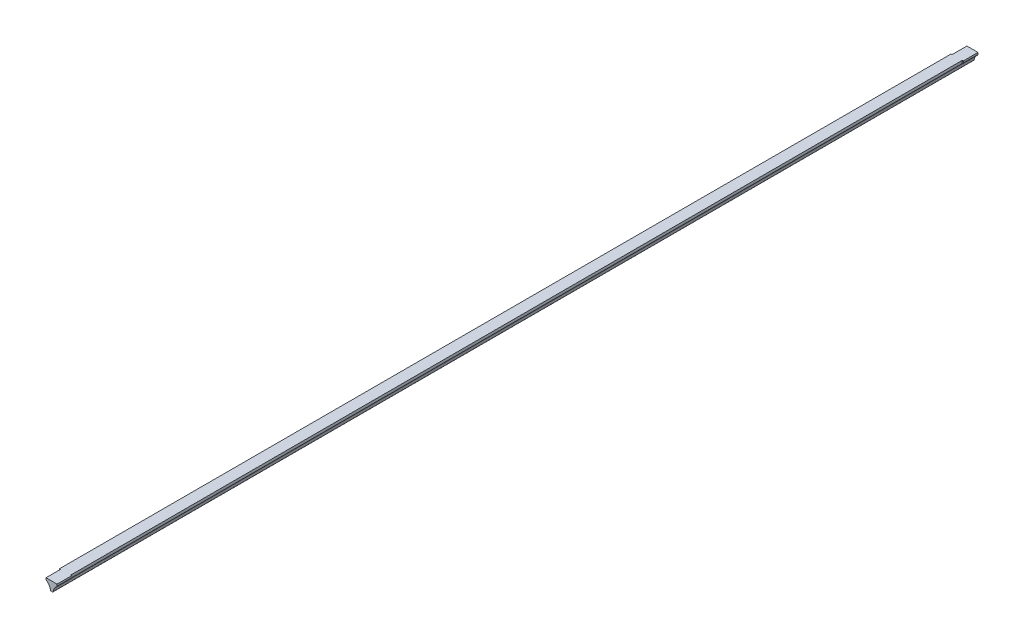
ISO-10303-21;
HEADER;
FILE_DESCRIPTION(('STEP AP214'),'2;1');
FILE_NAME('part.step','',(''),(''),'','','');
FILE_SCHEMA(('AUTOMOTIVE_DESIGN { 1 0 10303 214 1 1 1 1 }'));
ENDSEC;
DATA;
#1=APPLICATION_CONTEXT('core data for automotive mechanical design processes');
#2=APPLICATION_PROTOCOL_DEFINITION('international standard','automotive_design',2000,#1);
#3=PRODUCT_CONTEXT('',#1,'mechanical');
#4=PRODUCT('Part','Part','',(#3));
#5=PRODUCT_RELATED_PRODUCT_CATEGORY('part','',(#4));
#6=PRODUCT_DEFINITION_FORMATION('','',#4);
#7=PRODUCT_DEFINITION_CONTEXT('part definition',#1,'design');
#8=PRODUCT_DEFINITION('design','',#6,#7);
#9=PRODUCT_DEFINITION_SHAPE('','',#8);
#10=(LENGTH_UNIT() NAMED_UNIT(*) SI_UNIT(.MILLI.,.METRE.));
#11=(NAMED_UNIT(*) PLANE_ANGLE_UNIT() SI_UNIT($,.RADIAN.));
#12=(NAMED_UNIT(*) SI_UNIT($,.STERADIAN.) SOLID_ANGLE_UNIT());
#13=UNCERTAINTY_MEASURE_WITH_UNIT(LENGTH_MEASURE(1.E-05),#10,'distance_accuracy_value','');
#14=(GEOMETRIC_REPRESENTATION_CONTEXT(3) GLOBAL_UNCERTAINTY_ASSIGNED_CONTEXT((#13)) GLOBAL_UNIT_ASSIGNED_CONTEXT((#10,
#11,#12)) REPRESENTATION_CONTEXT('',''));
#15=CARTESIAN_POINT('',(0.,0.,0.));
#16=DIRECTION('',(0.,0.,1.));
#17=DIRECTION('',(1.,0.,0.));
#18=AXIS2_PLACEMENT_3D('',#15,#16,#17);
#19=CARTESIAN_POINT('',(-3.43878578810215,2.46500868702452,-250.));
#20=DIRECTION('',(0.,0.,1.));
#21=DIRECTION('',(1.,0.,0.));
#22=AXIS2_PLACEMENT_3D('',#19,#20,#21);
#23=CYLINDRICAL_SURFACE('',#22,0.125822813650088);
#24=CARTESIAN_POINT('',(-3.43878578810215,2.46500868702452,-242.));
#25=DIRECTION('',(0.,0.,-1.));
#26=DIRECTION('',(-1.,0.,0.));
#27=AXIS2_PLACEMENT_3D('',#24,#25,#26);
#28=CIRCLE('',#27,0.125822813650088);
#29=CARTESIAN_POINT('',(-3.56460860175224,2.46500868702452,-242.));
#30=VERTEX_POINT('',#29);
#31=EDGE_CURVE('E317',#30,#30,#28,.T.);
#32=ORIENTED_EDGE('',*,*,#31,.T.);
#33=EDGE_LOOP('',(#32));
#34=FACE_BOUND('',#33,.T.);
#35=CARTESIAN_POINT('',(-3.43878578810215,2.46500868702452,-249.));
#36=DIRECTION('',(0.,0.,1.));
#37=DIRECTION('',(1.,0.,0.));
#38=AXIS2_PLACEMENT_3D('',#35,#36,#37);
#39=CIRCLE('',#38,0.125822813650089);
#40=CARTESIAN_POINT('',(-3.31296297445206,2.46500868702452,-249.));
#41=VERTEX_POINT('',#40);
#42=EDGE_CURVE('E321',#41,#41,#39,.T.);
#43=ORIENTED_EDGE('',*,*,#42,.T.);
#44=EDGE_LOOP('',(#43));
#45=FACE_BOUND('',#44,.T.);
#46=ADVANCED_FACE('F124',(#34,#45),#23,.T.);
#47=CARTESIAN_POINT('',(-3.43878578810215,2.46500868702452,250.));
#48=DIRECTION('',(0.,0.,-1.));
#49=DIRECTION('',(-1.,0.,0.));
#50=AXIS2_PLACEMENT_3D('',#47,#48,#49);
#51=CYLINDRICAL_SURFACE('',#50,0.125822813650088);
#52=CARTESIAN_POINT('',(-3.43878578810215,2.46500868702452,242.));
#53=DIRECTION('',(0.,0.,-1.));
#54=DIRECTION('',(-1.,0.,0.));
#55=AXIS2_PLACEMENT_3D('',#52,#53,#54);
#56=CIRCLE('',#55,0.125822813650088);
#57=CARTESIAN_POINT('',(-3.56460860175224,2.46500868702452,242.));
#58=VERTEX_POINT('',#57);
#59=EDGE_CURVE('E323',#58,#58,#56,.T.);
#60=ORIENTED_EDGE('',*,*,#59,.F.);
#61=EDGE_LOOP('',(#60));
#62=FACE_BOUND('',#61,.T.);
#63=CARTESIAN_POINT('',(-3.43878578810215,2.46500868702452,249.));
#64=DIRECTION('',(0.,0.,1.));
#65=DIRECTION('',(1.,0.,0.));
#66=AXIS2_PLACEMENT_3D('',#63,#64,#65);
#67=CIRCLE('',#66,0.125822813650089);
#68=CARTESIAN_POINT('',(-3.31296297445206,2.46500868702452,249.));
#69=VERTEX_POINT('',#68);
#70=EDGE_CURVE('E301',#69,#69,#67,.T.);
#71=ORIENTED_EDGE('',*,*,#70,.F.);
#72=EDGE_LOOP('',(#71));
#73=FACE_BOUND('',#72,.T.);
#74=ADVANCED_FACE('F682',(#62,#73),#51,.T.);
#75=CARTESIAN_POINT('',(2.86920806925575,0.,250.));
#76=DIRECTION('',(1.,0.,0.));
#77=DIRECTION('',(0.,1.,0.));
#78=AXIS2_PLACEMENT_3D('',#75,#76,#77);
#79=PLANE('',#78);
#80=DIRECTION('',(0.,1.,0.));
#81=VECTOR('',#80,1.);
#82=CARTESIAN_POINT('',(2.86920806925575,3.06854543083489,-242.));
#83=LINE('',#82,#81);
#84=CARTESIAN_POINT('',(2.86920806925575,2.13229461166655,-242.));
#85=VERTEX_POINT('',#84);
#86=CARTESIAN_POINT('',(2.86920806925575,3.06854543083489,-242.));
#87=VERTEX_POINT('',#86);
#88=EDGE_CURVE('E350',#85,#87,#83,.T.);
#89=ORIENTED_EDGE('',*,*,#88,.F.);
#90=DIRECTION('',(0.,0.,-1.));
#91=VECTOR('',#90,1.);
#92=CARTESIAN_POINT('',(2.86920806925575,2.13229461166655,250.));
#93=LINE('',#92,#91);
#94=CARTESIAN_POINT('',(2.86920806925575,2.13229461166655,-250.));
#95=VERTEX_POINT('',#94);
#96=EDGE_CURVE('E500',#85,#95,#93,.T.);
#97=ORIENTED_EDGE('',*,*,#96,.T.);
#98=DIRECTION('',(0.,-1.,0.));
#99=VECTOR('',#98,1.);
#100=CARTESIAN_POINT('',(2.86920806925575,0.,-250.));
#101=LINE('',#100,#99);
#102=CARTESIAN_POINT('',(2.86920806925575,3.06854543083489,-250.));
#103=VERTEX_POINT('',#102);
#104=EDGE_CURVE('E433',#103,#95,#101,.T.);
#105=ORIENTED_EDGE('',*,*,#104,.F.);
#106=DIRECTION('',(0.,0.,-1.));
#107=VECTOR('',#106,1.);
#108=CARTESIAN_POINT('',(2.86920806925575,3.06854543083489,250.));
#109=LINE('',#108,#107);
#110=EDGE_CURVE('E441',#87,#103,#109,.T.);
#111=ORIENTED_EDGE('',*,*,#110,.F.);
#112=EDGE_LOOP('',(#89,#97,#105,#111));
#113=FACE_BOUND('',#112,.T.);
#114=ADVANCED_FACE('F597',(#113),#79,.T.);
#115=CARTESIAN_POINT('',(-0.278549844655959,-1.34969065907953,250.));
#116=DIRECTION('',(0.,0.,-1.));
#117=DIRECTION('',(-1.,0.,0.));
#118=AXIS2_PLACEMENT_3D('',#115,#116,#117);
#119=CYLINDRICAL_SURFACE('',#118,0.522401061583565);
#120=CARTESIAN_POINT('',(-0.278549844655959,-1.34969065907953,-250.));
#121=DIRECTION('',(0.,0.,1.));
#122=DIRECTION('',(1.,0.,0.));
#123=AXIS2_PLACEMENT_3D('',#120,#121,#122);
#124=CIRCLE('',#123,0.522401061583565);
#125=CARTESIAN_POINT('',(-0.796044874215448,-1.42111728944144,-250.));
#126=VERTEX_POINT('',#125);
#127=CARTESIAN_POINT('',(-0.271314783755804,-1.87204161680567,-250.));
#128=VERTEX_POINT('',#127);
#129=EDGE_CURVE('E418',#126,#128,#124,.T.);
#130=ORIENTED_EDGE('',*,*,#129,.T.);
#131=DIRECTION('',(0.,0.,-1.));
#132=VECTOR('',#131,1.);
#133=CARTESIAN_POINT('',(-0.271314783755804,-1.87204161680567,250.));
#134=LINE('',#133,#132);
#135=CARTESIAN_POINT('',(-0.271314783755804,-1.87204161680567,250.));
#136=VERTEX_POINT('',#135);
#137=EDGE_CURVE('E453',#136,#128,#134,.T.);
#138=ORIENTED_EDGE('',*,*,#137,.F.);
#139=CARTESIAN_POINT('',(-0.278549844655959,-1.34969065907953,250.));
#140=DIRECTION('',(0.,0.,1.));
#141=DIRECTION('',(1.,0.,0.));
#142=AXIS2_PLACEMENT_3D('',#139,#140,#141);
#143=CIRCLE('',#142,0.522401061583565);
#144=CARTESIAN_POINT('',(-0.796044874215448,-1.42111728944144,250.));
#145=VERTEX_POINT('',#144);
#146=EDGE_CURVE('E393',#145,#136,#143,.T.);
#147=ORIENTED_EDGE('',*,*,#146,.F.);
#148=DIRECTION('',(0.,0.,-1.));
#149=VECTOR('',#148,1.);
#150=CARTESIAN_POINT('',(-0.796044874215448,-1.42111728944144,250.));
#151=LINE('',#150,#149);
#152=EDGE_CURVE('E456',#145,#126,#151,.T.);
#153=ORIENTED_EDGE('',*,*,#152,.T.);
#154=EDGE_LOOP('',(#130,#138,#147,#153));
#155=FACE_BOUND('',#154,.T.);
#156=ADVANCED_FACE('F544',(#155),#119,.T.);
#157=CARTESIAN_POINT('',(0.,-21.4602025315357,250.));
#158=DIRECTION('',(0.,0.,-1.));
#159=DIRECTION('',(-1.,0.,0.));
#160=AXIS2_PLACEMENT_3D('',#157,#158,#159);
#161=CYLINDRICAL_SURFACE('',#160,19.5900398093838);
#162=CARTESIAN_POINT('',(0.,-21.4602025315357,-250.));
#163=DIRECTION('',(0.,0.,1.));
#164=DIRECTION('',(1.,0.,0.));
#165=AXIS2_PLACEMENT_3D('',#162,#163,#164);
#166=CIRCLE('',#165,19.5900398093838);
#167=CARTESIAN_POINT('',(0.271314783755798,-1.87204161680567,-250.));
#168=VERTEX_POINT('',#167);
#169=EDGE_CURVE('E422',#168,#128,#166,.T.);
#170=ORIENTED_EDGE('',*,*,#169,.F.);
#171=DIRECTION('',(0.,0.,-1.));
#172=VECTOR('',#171,1.);
#173=CARTESIAN_POINT('',(0.271314783755798,-1.87204161680567,250.));
#174=LINE('',#173,#172);
#175=CARTESIAN_POINT('',(0.271314783755798,-1.87204161680567,250.));
#176=VERTEX_POINT('',#175);
#177=EDGE_CURVE('E450',#176,#168,#174,.T.);
#178=ORIENTED_EDGE('',*,*,#177,.F.);
#179=CARTESIAN_POINT('',(0.,-21.4602025315357,250.));
#180=DIRECTION('',(0.,0.,1.));
#181=DIRECTION('',(1.,0.,0.));
#182=AXIS2_PLACEMENT_3D('',#179,#180,#181);
#183=CIRCLE('',#182,19.5900398093838);
#184=EDGE_CURVE('E396',#176,#136,#183,.T.);
#185=ORIENTED_EDGE('',*,*,#184,.T.);
#186=ORIENTED_EDGE('',*,*,#137,.T.);
#187=EDGE_LOOP('',(#170,#178,#185,#186));
#188=FACE_BOUND('',#187,.T.);
#189=ADVANCED_FACE('F900',(#188),#161,.F.);
#190=CARTESIAN_POINT('',(0.278549844656517,-1.34969065907954,250.));
#191=DIRECTION('',(0.,0.,-1.));
#192=DIRECTION('',(-1.,0.,0.));
#193=AXIS2_PLACEMENT_3D('',#190,#191,#192);
#194=CYLINDRICAL_SURFACE('',#193,0.52240106158357);
#195=CARTESIAN_POINT('',(0.278549844656517,-1.34969065907954,-250.));
#196=DIRECTION('',(0.,0.,1.));
#197=DIRECTION('',(1.,0.,0.));
#198=AXIS2_PLACEMENT_3D('',#195,#196,#197);
#199=CIRCLE('',#198,0.52240106158357);
#200=CARTESIAN_POINT('',(0.796044874215999,-1.42111728944155,-250.));
#201=VERTEX_POINT('',#200);
#202=EDGE_CURVE('E426',#168,#201,#199,.T.);
#203=ORIENTED_EDGE('',*,*,#202,.T.);
#204=DIRECTION('',(0.,0.,-1.));
#205=VECTOR('',#204,1.);
#206=CARTESIAN_POINT('',(0.796044874215999,-1.42111728944155,250.));
#207=LINE('',#206,#205);
#208=CARTESIAN_POINT('',(0.796044874215999,-1.42111728944155,250.));
#209=VERTEX_POINT('',#208);
#210=EDGE_CURVE('E446',#209,#201,#207,.T.);
#211=ORIENTED_EDGE('',*,*,#210,.F.);
#212=CARTESIAN_POINT('',(0.278549844656517,-1.34969065907954,250.));
#213=DIRECTION('',(0.,0.,1.));
#214=DIRECTION('',(1.,0.,0.));
#215=AXIS2_PLACEMENT_3D('',#212,#213,#214);
#216=CIRCLE('',#215,0.52240106158357);
#217=EDGE_CURVE('E400',#176,#209,#216,.T.);
#218=ORIENTED_EDGE('',*,*,#217,.F.);
#219=ORIENTED_EDGE('',*,*,#177,.T.);
#220=EDGE_LOOP('',(#203,#211,#218,#219));
#221=FACE_BOUND('',#220,.T.);
#222=ADVANCED_FACE('F890',(#221),#194,.T.);
#223=CARTESIAN_POINT('',(5.47386077616061,-2.06676721503345,250.));
#224=DIRECTION('',(0.,0.,-1.));
#225=DIRECTION('',(-1.,0.,0.));
#226=AXIS2_PLACEMENT_3D('',#223,#224,#225);
#227=CYLINDRICAL_SURFACE('',#226,4.72216321603804);
#228=DIRECTION('',(0.,0.,-1.));
#229=VECTOR('',#228,1.);
#230=CARTESIAN_POINT('',(2.16179102311861,1.29909365402918,250.));
#231=LINE('',#230,#229);
#232=CARTESIAN_POINT('',(2.16179102311861,1.29909365402918,-242.));
#233=VERTEX_POINT('',#232);
#234=CARTESIAN_POINT('',(2.16179102311861,1.29909365402918,242.));
#235=VERTEX_POINT('',#234);
#236=EDGE_CURVE('E465',#233,#235,#231,.F.);
#237=ORIENTED_EDGE('',*,*,#236,.T.);
#238=CARTESIAN_POINT('',(5.47386077616061,-2.06676721503345,242.));
#239=DIRECTION('',(0.,0.,1.));
#240=DIRECTION('',(1.,0.,0.));
#241=AXIS2_PLACEMENT_3D('',#238,#239,#240);
#242=CIRCLE('',#241,4.72216321603804);
#243=CARTESIAN_POINT('',(2.66646541055926,1.73025223449572,242.));
#244=VERTEX_POINT('',#243);
#245=EDGE_CURVE('E385',#244,#235,#242,.T.);
#246=ORIENTED_EDGE('',*,*,#245,.F.);
#247=DIRECTION('',(0.,0.,-1.));
#248=VECTOR('',#247,1.);
#249=CARTESIAN_POINT('',(2.66646541055926,1.73025223449572,250.));
#250=LINE('',#249,#248);
#251=CARTESIAN_POINT('',(2.66646541055926,1.73025223449572,250.));
#252=VERTEX_POINT('',#251);
#253=EDGE_CURVE('E459',#244,#252,#250,.F.);
#254=ORIENTED_EDGE('',*,*,#253,.T.);
#255=CARTESIAN_POINT('',(5.47386077616061,-2.06676721503345,250.));
#256=DIRECTION('',(0.,0.,1.));
#257=DIRECTION('',(1.,0.,0.));
#258=AXIS2_PLACEMENT_3D('',#255,#256,#257);
#259=CIRCLE('',#258,4.72216321603804);
#260=EDGE_CURVE('E404',#252,#209,#259,.T.);
#261=ORIENTED_EDGE('',*,*,#260,.T.);
#262=ORIENTED_EDGE('',*,*,#210,.T.);
#263=CARTESIAN_POINT('',(5.47386077616061,-2.06676721503345,-250.));
#264=DIRECTION('',(0.,0.,1.));
#265=DIRECTION('',(1.,0.,0.));
#266=AXIS2_PLACEMENT_3D('',#263,#264,#265);
#267=CIRCLE('',#266,4.72216321603804);
#268=CARTESIAN_POINT('',(2.66646541055926,1.73025223449572,-250.));
#269=VERTEX_POINT('',#268);
#270=EDGE_CURVE('E430',#269,#201,#267,.T.);
#271=ORIENTED_EDGE('',*,*,#270,.F.);
#272=DIRECTION('',(0.,0.,-1.));
#273=VECTOR('',#272,1.);
#274=CARTESIAN_POINT('',(2.66646541055926,1.73025223449572,250.));
#275=LINE('',#274,#273);
#276=CARTESIAN_POINT('',(2.66646541055926,1.73025223449572,-242.));
#277=VERTEX_POINT('',#276);
#278=EDGE_CURVE('E462',#269,#277,#275,.F.);
#279=ORIENTED_EDGE('',*,*,#278,.T.);
#280=CARTESIAN_POINT('',(5.47386077616061,-2.06676721503345,-242.));
#281=DIRECTION('',(0.,0.,1.));
#282=DIRECTION('',(1.,0.,0.));
#283=AXIS2_PLACEMENT_3D('',#280,#281,#282);
#284=CIRCLE('',#283,4.72216321603804);
#285=EDGE_CURVE('E382',#277,#233,#284,.T.);
#286=ORIENTED_EDGE('',*,*,#285,.T.);
#287=EDGE_LOOP('',(#237,#246,#254,#261,#262,#271,#279,#286));
#288=FACE_BOUND('',#287,.T.);
#289=ADVANCED_FACE('F580',(#288),#227,.F.);
#290=DIRECTION('',(0.,-1.,0.));
#291=VECTOR('',#290,1.);
#292=CARTESIAN_POINT('',(2.86920806925575,0.,250.));
#293=LINE('',#292,#291);
#294=CARTESIAN_POINT('',(2.86920806925575,3.06854543083489,250.));
#295=VERTEX_POINT('',#294);
#296=CARTESIAN_POINT('',(2.86920806925575,2.13229461166655,250.));
#297=VERTEX_POINT('',#296);
#298=EDGE_CURVE('E407',#295,#297,#293,.T.);
#299=ORIENTED_EDGE('',*,*,#298,.T.);
#300=DIRECTION('',(0.,0.,-1.));
#301=VECTOR('',#300,1.);
#302=CARTESIAN_POINT('',(2.86920806925575,2.13229461166655,250.));
#303=LINE('',#302,#301);
#304=CARTESIAN_POINT('',(2.86920806925575,2.13229461166655,242.));
#305=VERTEX_POINT('',#304);
#306=EDGE_CURVE('E507',#297,#305,#303,.T.);
#307=ORIENTED_EDGE('',*,*,#306,.T.);
#308=DIRECTION('',(0.,-1.,0.));
#309=VECTOR('',#308,1.);
#310=CARTESIAN_POINT('',(2.86920806925575,3.06854543083489,242.));
#311=LINE('',#310,#309);
#312=CARTESIAN_POINT('',(2.86920806925575,3.06854543083489,242.));
#313=VERTEX_POINT('',#312);
#314=EDGE_CURVE('E367',#313,#305,#311,.T.);
#315=ORIENTED_EDGE('',*,*,#314,.F.);
#316=EDGE_CURVE('E442',#295,#313,#109,.T.);
#317=ORIENTED_EDGE('',*,*,#316,.F.);
#318=EDGE_LOOP('',(#299,#307,#315,#317));
#319=FACE_BOUND('',#318,.T.);
#320=ADVANCED_FACE('F570',(#319),#79,.T.);
#321=CARTESIAN_POINT('',(0.,3.06854543083485,250.));
#322=DIRECTION('',(0.,1.,0.));
#323=DIRECTION('',(-1.,0.,0.));
#324=AXIS2_PLACEMENT_3D('',#321,#322,#323);
#325=PLANE('',#324);
#326=DIRECTION('',(1.,0.,0.));
#327=VECTOR('',#326,1.);
#328=CARTESIAN_POINT('',(-3.14844866988407,3.06854543083481,-242.));
#329=LINE('',#328,#327);
#330=CARTESIAN_POINT('',(-3.70655983665146,3.06854543083481,-242.));
#331=VERTEX_POINT('',#330);
#332=CARTESIAN_POINT('',(-3.14844866988407,3.06854543083481,-242.));
#333=VERTEX_POINT('',#332);
#334=EDGE_CURVE('E272',#331,#333,#329,.T.);
#335=ORIENTED_EDGE('',*,*,#334,.F.);
#336=DIRECTION('',(0.,0.,-1.));
#337=VECTOR('',#336,1.);
#338=CARTESIAN_POINT('',(-3.70655983665146,3.06854543083481,250.));
#339=LINE('',#338,#337);
#340=CARTESIAN_POINT('',(-3.70655983665146,3.06854543083481,242.));
#341=VERTEX_POINT('',#340);
#342=EDGE_CURVE('E414',#341,#331,#339,.T.);
#343=ORIENTED_EDGE('',*,*,#342,.F.);
#344=DIRECTION('',(1.,0.,0.));
#345=VECTOR('',#344,1.);
#346=CARTESIAN_POINT('',(-3.14844866988407,3.06854543083481,242.));
#347=LINE('',#346,#345);
#348=CARTESIAN_POINT('',(-3.14844866988407,3.06854543083481,242.));
#349=VERTEX_POINT('',#348);
#350=EDGE_CURVE('E341',#341,#349,#347,.T.);
#351=ORIENTED_EDGE('',*,*,#350,.T.);
#352=DIRECTION('',(0.,0.,-1.));
#353=VECTOR('',#352,1.);
#354=CARTESIAN_POINT('',(-3.14844866988407,3.06854543083481,250.));
#355=LINE('',#354,#353);
#356=CARTESIAN_POINT('',(-3.14844866988407,3.06854543083481,250.));
#357=VERTEX_POINT('',#356);
#358=EDGE_CURVE('E333',#357,#349,#355,.T.);
#359=ORIENTED_EDGE('',*,*,#358,.F.);
#360=DIRECTION('',(1.,0.,0.));
#361=VECTOR('',#360,1.);
#362=CARTESIAN_POINT('',(0.,3.06854543083485,250.));
#363=LINE('',#362,#361);
#364=EDGE_CURVE('E411',#357,#295,#363,.T.);
#365=ORIENTED_EDGE('',*,*,#364,.T.);
#366=ORIENTED_EDGE('',*,*,#316,.T.);
#367=DIRECTION('',(-1.,0.,0.));
#368=VECTOR('',#367,1.);
#369=CARTESIAN_POINT('',(2.86920806925575,3.06854543083489,242.));
#370=LINE('',#369,#368);
#371=CARTESIAN_POINT('',(2.31109690248836,3.06854543083489,242.));
#372=VERTEX_POINT('',#371);
#373=EDGE_CURVE('E366',#313,#372,#370,.T.);
#374=ORIENTED_EDGE('',*,*,#373,.T.);
#375=DIRECTION('',(0.,0.,-1.));
#376=VECTOR('',#375,1.);
#377=CARTESIAN_POINT('',(2.31109690248836,3.06854543083489,251.90249200464));
#378=LINE('',#377,#376);
#379=CARTESIAN_POINT('',(2.31109690248836,3.06854543083489,-242.));
#380=VERTEX_POINT('',#379);
#381=EDGE_CURVE('E371',#372,#380,#378,.T.);
#382=ORIENTED_EDGE('',*,*,#381,.T.);
#383=DIRECTION('',(1.,0.,0.));
#384=VECTOR('',#383,1.);
#385=CARTESIAN_POINT('',(2.86920806925575,3.06854543083489,-242.));
#386=LINE('',#385,#384);
#387=EDGE_CURVE('E359',#380,#87,#386,.T.);
#388=ORIENTED_EDGE('',*,*,#387,.T.);
#389=ORIENTED_EDGE('',*,*,#110,.T.);
#390=DIRECTION('',(1.,0.,0.));
#391=VECTOR('',#390,1.);
#392=CARTESIAN_POINT('',(0.,3.06854543083485,-250.));
#393=LINE('',#392,#391);
#394=CARTESIAN_POINT('',(-3.14844866988407,3.06854543083481,-250.));
#395=VERTEX_POINT('',#394);
#396=EDGE_CURVE('E299',#395,#103,#393,.T.);
#397=ORIENTED_EDGE('',*,*,#396,.F.);
#398=DIRECTION('',(0.,0.,1.));
#399=VECTOR('',#398,1.);
#400=CARTESIAN_POINT('',(-3.14844866988407,3.06854543083481,-250.));
#401=LINE('',#400,#399);
#402=EDGE_CURVE('E289',#395,#333,#401,.T.);
#403=ORIENTED_EDGE('',*,*,#402,.T.);
#404=EDGE_LOOP('',(#335,#343,#351,#359,#365,#366,#374,#382,#388,#389,#397,#403));
#405=FACE_BOUND('',#404,.T.);
#406=ADVANCED_FACE('F297',(#405),#325,.T.);
#407=CARTESIAN_POINT('',(-3.70655983665142,0.,250.));
#408=DIRECTION('',(1.,0.,0.));
#409=DIRECTION('',(0.,1.,0.));
#410=AXIS2_PLACEMENT_3D('',#407,#408,#409);
#411=PLANE('',#410);
#412=DIRECTION('',(0.,1.,0.));
#413=VECTOR('',#412,1.);
#414=CARTESIAN_POINT('',(-3.70655983665146,3.06854543083481,-242.));
#415=LINE('',#414,#413);
#416=CARTESIAN_POINT('',(-3.70655983665145,2.63752179656491,-242.));
#417=VERTEX_POINT('',#416);
#418=EDGE_CURVE('E278',#417,#331,#415,.T.);
#419=ORIENTED_EDGE('',*,*,#418,.F.);
#420=DIRECTION('',(0.,0.,1.));
#421=VECTOR('',#420,1.);
#422=CARTESIAN_POINT('',(-3.70655983665145,2.63752179656491,242.));
#423=LINE('',#422,#421);
#424=CARTESIAN_POINT('',(-3.70655983665145,2.63752179656491,242.));
#425=VERTEX_POINT('',#424);
#426=EDGE_CURVE('E140',#417,#425,#423,.T.);
#427=ORIENTED_EDGE('',*,*,#426,.T.);
#428=DIRECTION('',(0.,1.,0.));
#429=VECTOR('',#428,1.);
#430=CARTESIAN_POINT('',(-3.70655983665146,3.06854543083481,242.));
#431=LINE('',#430,#429);
#432=EDGE_CURVE('E338',#425,#341,#431,.T.);
#433=ORIENTED_EDGE('',*,*,#432,.T.);
#434=ORIENTED_EDGE('',*,*,#342,.T.);
#435=EDGE_LOOP('',(#419,#427,#433,#434));
#436=FACE_BOUND('',#435,.T.);
#437=ADVANCED_FACE('F860',(#436),#411,.F.);
#438=CARTESIAN_POINT('',(-5.47386077616006,-2.06676721503334,250.));
#439=DIRECTION('',(0.,0.,-1.));
#440=DIRECTION('',(-1.,0.,0.));
#441=AXIS2_PLACEMENT_3D('',#438,#439,#440);
#442=CYLINDRICAL_SURFACE('',#441,4.72216321603804);
#443=CARTESIAN_POINT('',(-5.47386077616006,-2.06676721503334,-242.));
#444=DIRECTION('',(0.,0.,1.));
#445=DIRECTION('',(-1.,0.,0.));
#446=AXIS2_PLACEMENT_3D('',#443,#444,#445);
#447=CIRCLE('',#446,4.72216321603804);
#448=CARTESIAN_POINT('',(-2.91896990690695,1.90454970572604,-242.));
#449=VERTEX_POINT('',#448);
#450=CARTESIAN_POINT('',(-3.42364429434758,2.18710605724537,-242.));
#451=VERTEX_POINT('',#450);
#452=EDGE_CURVE('E294',#449,#451,#447,.T.);
#453=ORIENTED_EDGE('',*,*,#452,.F.);
#454=DIRECTION('',(0.,0.,-1.));
#455=VECTOR('',#454,1.);
#456=CARTESIAN_POINT('',(-2.91896990690695,1.90454970572604,250.));
#457=LINE('',#456,#455);
#458=CARTESIAN_POINT('',(-2.91896990690695,1.90454970572604,-250.));
#459=VERTEX_POINT('',#458);
#460=EDGE_CURVE('E482',#449,#459,#457,.T.);
#461=ORIENTED_EDGE('',*,*,#460,.T.);
#462=CARTESIAN_POINT('',(-5.47386077616006,-2.06676721503334,-250.));
#463=DIRECTION('',(0.,0.,1.));
#464=DIRECTION('',(1.,0.,0.));
#465=AXIS2_PLACEMENT_3D('',#462,#463,#464);
#466=CIRCLE('',#465,4.72216321603804);
#467=EDGE_CURVE('E388',#126,#459,#466,.T.);
#468=ORIENTED_EDGE('',*,*,#467,.F.);
#469=ORIENTED_EDGE('',*,*,#152,.F.);
#470=CARTESIAN_POINT('',(-5.47386077616006,-2.06676721503334,250.));
#471=DIRECTION('',(0.,0.,1.));
#472=DIRECTION('',(1.,0.,0.));
#473=AXIS2_PLACEMENT_3D('',#470,#471,#472);
#474=CIRCLE('',#473,4.72216321603804);
#475=CARTESIAN_POINT('',(-2.91896990690695,1.90454970572604,250.));
#476=VERTEX_POINT('',#475);
#477=EDGE_CURVE('E389',#145,#476,#474,.T.);
#478=ORIENTED_EDGE('',*,*,#477,.T.);
#479=DIRECTION('',(0.,0.,-1.));
#480=VECTOR('',#479,1.);
#481=CARTESIAN_POINT('',(-2.91896990690695,1.90454970572604,250.));
#482=LINE('',#481,#480);
#483=CARTESIAN_POINT('',(-2.91896990690695,1.90454970572604,242.));
#484=VERTEX_POINT('',#483);
#485=EDGE_CURVE('E478',#476,#484,#482,.T.);
#486=ORIENTED_EDGE('',*,*,#485,.T.);
#487=CARTESIAN_POINT('',(-5.47386077616006,-2.06676721503334,242.));
#488=DIRECTION('',(0.,0.,1.));
#489=DIRECTION('',(-1.,0.,0.));
#490=AXIS2_PLACEMENT_3D('',#487,#488,#489);
#491=CIRCLE('',#490,4.72216321603804);
#492=CARTESIAN_POINT('',(-3.42364429434758,2.18710605724537,242.));
#493=VERTEX_POINT('',#492);
#494=EDGE_CURVE('E327',#484,#493,#491,.T.);
#495=ORIENTED_EDGE('',*,*,#494,.T.);
#496=DIRECTION('',(0.,0.,-1.));
#497=VECTOR('',#496,1.);
#498=CARTESIAN_POINT('',(-3.42364429434758,2.18710605724537,250.));
#499=LINE('',#498,#497);
#500=EDGE_CURVE('E474',#493,#451,#499,.T.);
#501=ORIENTED_EDGE('',*,*,#500,.T.);
#502=EDGE_LOOP('',(#453,#461,#468,#469,#478,#486,#495,#501));
#503=FACE_BOUND('',#502,.T.);
#504=ADVANCED_FACE('F535',(#503),#442,.F.);
#505=CARTESIAN_POINT('',(0.,0.,-250.));
#506=DIRECTION('',(0.,0.,1.));
#507=DIRECTION('',(1.,0.,0.));
#508=AXIS2_PLACEMENT_3D('',#505,#506,#507);
#509=PLANE('',#508);
#510=ORIENTED_EDGE('',*,*,#467,.T.);
#511=CARTESIAN_POINT('',(-2.64844866988407,2.32504733986874,-250.));
#512=DIRECTION('',(0.,0.,1.));
#513=DIRECTION('',(1.,0.,0.));
#514=AXIS2_PLACEMENT_3D('',#511,#512,#513);
#515=CIRCLE('',#514,0.5);
#516=CARTESIAN_POINT('',(-3.14844866988407,2.32504733986874,-250.));
#517=VERTEX_POINT('',#516);
#518=EDGE_CURVE('E488',#459,#517,#515,.F.);
#519=ORIENTED_EDGE('',*,*,#518,.T.);
#520=DIRECTION('',(0.,-1.,0.));
#521=VECTOR('',#520,1.);
#522=CARTESIAN_POINT('',(-3.14844866988407,3.06854543083481,-250.));
#523=LINE('',#522,#521);
#524=EDGE_CURVE('E302',#395,#517,#523,.T.);
#525=ORIENTED_EDGE('',*,*,#524,.F.);
#526=ORIENTED_EDGE('',*,*,#396,.T.);
#527=ORIENTED_EDGE('',*,*,#104,.T.);
#528=CARTESIAN_POINT('',(2.36920806925575,2.13229461166655,-250.));
#529=DIRECTION('',(0.,0.,1.));
#530=DIRECTION('',(1.,0.,0.));
#531=AXIS2_PLACEMENT_3D('',#528,#529,#530);
#532=CIRCLE('',#531,0.5);
#533=EDGE_CURVE('E485',#95,#269,#532,.F.);
#534=ORIENTED_EDGE('',*,*,#533,.T.);
#535=ORIENTED_EDGE('',*,*,#270,.T.);
#536=ORIENTED_EDGE('',*,*,#202,.F.);
#537=ORIENTED_EDGE('',*,*,#169,.T.);
#538=ORIENTED_EDGE('',*,*,#129,.F.);
#539=EDGE_LOOP('',(#510,#519,#525,#526,#527,#534,#535,#536,#537,#538));
#540=FACE_BOUND('',#539,.T.);
#541=CARTESIAN_POINT('',(2.61920806925576,2.56854543083489,-250.));
#542=DIRECTION('',(0.,0.,-1.));
#543=DIRECTION('',(-1.,0.,0.));
#544=AXIS2_PLACEMENT_3D('',#541,#542,#543);
#545=CIRCLE('',#544,0.139327756215086);
#546=CARTESIAN_POINT('',(2.47988031304067,2.56854543083489,-250.));
#547=VERTEX_POINT('',#546);
#548=EDGE_CURVE('E313',#547,#547,#545,.T.);
#549=ORIENTED_EDGE('',*,*,#548,.F.);
#550=EDGE_LOOP('',(#549));
#551=FACE_BOUND('',#550,.T.);
#552=ADVANCED_FACE('F538',(#540,#551),#509,.F.);
#553=CARTESIAN_POINT('',(0.,0.,250.));
#554=DIRECTION('',(0.,0.,1.));
#555=DIRECTION('',(1.,0.,0.));
#556=AXIS2_PLACEMENT_3D('',#553,#554,#555);
#557=PLANE('',#556);
#558=DIRECTION('',(0.,-1.,0.));
#559=VECTOR('',#558,1.);
#560=CARTESIAN_POINT('',(-3.14844866988407,3.06854543083481,250.));
#561=LINE('',#560,#559);
#562=CARTESIAN_POINT('',(-3.14844866988407,2.32504733986874,250.));
#563=VERTEX_POINT('',#562);
#564=EDGE_CURVE('E329',#357,#563,#561,.T.);
#565=ORIENTED_EDGE('',*,*,#564,.T.);
#566=CARTESIAN_POINT('',(-2.64844866988407,2.32504733986874,250.));
#567=DIRECTION('',(0.,0.,1.));
#568=DIRECTION('',(1.,0.,0.));
#569=AXIS2_PLACEMENT_3D('',#566,#567,#568);
#570=CIRCLE('',#569,0.5);
#571=EDGE_CURVE('E497',#563,#476,#570,.T.);
#572=ORIENTED_EDGE('',*,*,#571,.T.);
#573=ORIENTED_EDGE('',*,*,#477,.F.);
#574=ORIENTED_EDGE('',*,*,#146,.T.);
#575=ORIENTED_EDGE('',*,*,#184,.F.);
#576=ORIENTED_EDGE('',*,*,#217,.T.);
#577=ORIENTED_EDGE('',*,*,#260,.F.);
#578=CARTESIAN_POINT('',(2.36920806925575,2.13229461166655,250.));
#579=DIRECTION('',(0.,0.,1.));
#580=DIRECTION('',(1.,0.,0.));
#581=AXIS2_PLACEMENT_3D('',#578,#579,#580);
#582=CIRCLE('',#581,0.5);
#583=EDGE_CURVE('E494',#252,#297,#582,.T.);
#584=ORIENTED_EDGE('',*,*,#583,.T.);
#585=ORIENTED_EDGE('',*,*,#298,.F.);
#586=ORIENTED_EDGE('',*,*,#364,.F.);
#587=EDGE_LOOP('',(#565,#572,#573,#574,#575,#576,#577,#584,#585,#586));
#588=FACE_BOUND('',#587,.T.);
#589=CARTESIAN_POINT('',(2.61920806925576,2.56854543083489,250.));
#590=DIRECTION('',(0.,0.,-1.));
#591=DIRECTION('',(-1.,0.,0.));
#592=AXIS2_PLACEMENT_3D('',#589,#590,#591);
#593=CIRCLE('',#592,0.139327756215086);
#594=CARTESIAN_POINT('',(2.47988031304067,2.56854543083489,250.));
#595=VERTEX_POINT('',#594);
#596=EDGE_CURVE('E308',#595,#595,#593,.T.);
#597=ORIENTED_EDGE('',*,*,#596,.T.);
#598=EDGE_LOOP('',(#597));
#599=FACE_BOUND('',#598,.T.);
#600=ADVANCED_FACE('F564',(#588,#599),#557,.T.);
#601=CARTESIAN_POINT('',(0.,0.,242.));
#602=DIRECTION('',(0.,0.,1.));
#603=DIRECTION('',(1.,0.,0.));
#604=AXIS2_PLACEMENT_3D('',#601,#602,#603);
#605=PLANE('',#604);
#606=CARTESIAN_POINT('',(2.61920806925576,2.56854543083489,242.));
#607=DIRECTION('',(0.,0.,-1.));
#608=DIRECTION('',(-1.,0.,0.));
#609=AXIS2_PLACEMENT_3D('',#606,#607,#608);
#610=CIRCLE('',#609,0.139327756215086);
#611=CARTESIAN_POINT('',(2.47988031304067,2.56854543083489,242.));
#612=VERTEX_POINT('',#611);
#613=EDGE_CURVE('E328',#612,#612,#610,.T.);
#614=ORIENTED_EDGE('',*,*,#613,.F.);
#615=EDGE_LOOP('',(#614));
#616=FACE_BOUND('',#615,.T.);
#617=ORIENTED_EDGE('',*,*,#314,.T.);
#618=CARTESIAN_POINT('',(2.36920806925575,2.13229461166655,242.));
#619=DIRECTION('',(0.,0.,1.));
#620=DIRECTION('',(1.,0.,0.));
#621=AXIS2_PLACEMENT_3D('',#618,#619,#620);
#622=CIRCLE('',#621,0.5);
#623=EDGE_CURVE('E511',#305,#244,#622,.F.);
#624=ORIENTED_EDGE('',*,*,#623,.T.);
#625=ORIENTED_EDGE('',*,*,#245,.T.);
#626=CARTESIAN_POINT('',(1.81109690248836,1.65548337576,242.));
#627=DIRECTION('',(0.,0.,1.));
#628=DIRECTION('',(1.,0.,0.));
#629=AXIS2_PLACEMENT_3D('',#626,#627,#628);
#630=CIRCLE('',#629,0.5);
#631=CARTESIAN_POINT('',(2.31109690248836,1.65548337576,242.));
#632=VERTEX_POINT('',#631);
#633=EDGE_CURVE('E521',#235,#632,#630,.T.);
#634=ORIENTED_EDGE('',*,*,#633,.T.);
#635=DIRECTION('',(0.,-1.,0.));
#636=VECTOR('',#635,1.);
#637=CARTESIAN_POINT('',(2.31109690248836,3.06854543083489,242.));
#638=LINE('',#637,#636);
#639=EDGE_CURVE('E372',#372,#632,#638,.T.);
#640=ORIENTED_EDGE('',*,*,#639,.F.);
#641=ORIENTED_EDGE('',*,*,#373,.F.);
#642=EDGE_LOOP('',(#617,#624,#625,#634,#640,#641));
#643=FACE_BOUND('',#642,.T.);
#644=ADVANCED_FACE('F577',(#616,#643),#605,.F.);
#645=CARTESIAN_POINT('',(2.31109690248836,3.06854543083489,251.90249200464));
#646=DIRECTION('',(1.,0.,0.));
#647=DIRECTION('',(0.,0.,-1.));
#648=AXIS2_PLACEMENT_3D('',#645,#646,#647);
#649=PLANE('',#648);
#650=ORIENTED_EDGE('',*,*,#639,.T.);
#651=DIRECTION('',(0.,0.,-1.));
#652=VECTOR('',#651,1.);
#653=CARTESIAN_POINT('',(2.31109690248836,1.65548337576,251.90249200464));
#654=LINE('',#653,#652);
#655=CARTESIAN_POINT('',(2.31109690248836,1.65548337576,-242.));
#656=VERTEX_POINT('',#655);
#657=EDGE_CURVE('E469',#632,#656,#654,.T.);
#658=ORIENTED_EDGE('',*,*,#657,.T.);
#659=DIRECTION('',(0.,1.,0.));
#660=VECTOR('',#659,1.);
#661=CARTESIAN_POINT('',(2.31109690248836,3.06854543083489,-242.));
#662=LINE('',#661,#660);
#663=EDGE_CURVE('E363',#656,#380,#662,.T.);
#664=ORIENTED_EDGE('',*,*,#663,.T.);
#665=ORIENTED_EDGE('',*,*,#381,.F.);
#666=EDGE_LOOP('',(#650,#658,#664,#665));
#667=FACE_BOUND('',#666,.T.);
#668=ADVANCED_FACE('F589',(#667),#649,.T.);
#669=CARTESIAN_POINT('',(0.,0.,-242.));
#670=DIRECTION('',(0.,0.,1.));
#671=DIRECTION('',(1.,0.,0.));
#672=AXIS2_PLACEMENT_3D('',#669,#670,#671);
#673=PLANE('',#672);
#674=CARTESIAN_POINT('',(2.61920806925576,2.56854543083489,-242.));
#675=DIRECTION('',(0.,0.,-1.));
#676=DIRECTION('',(-1.,0.,0.));
#677=AXIS2_PLACEMENT_3D('',#674,#675,#676);
#678=CIRCLE('',#677,0.139327756215086);
#679=CARTESIAN_POINT('',(2.47988031304067,2.56854543083489,-242.));
#680=VERTEX_POINT('',#679);
#681=EDGE_CURVE('E318',#680,#680,#678,.T.);
#682=ORIENTED_EDGE('',*,*,#681,.T.);
#683=EDGE_LOOP('',(#682));
#684=FACE_BOUND('',#683,.T.);
#685=ORIENTED_EDGE('',*,*,#285,.F.);
#686=CARTESIAN_POINT('',(2.36920806925575,2.13229461166655,-242.));
#687=DIRECTION('',(0.,0.,1.));
#688=DIRECTION('',(1.,0.,0.));
#689=AXIS2_PLACEMENT_3D('',#686,#687,#688);
#690=CIRCLE('',#689,0.5);
#691=EDGE_CURVE('E504',#277,#85,#690,.T.);
#692=ORIENTED_EDGE('',*,*,#691,.T.);
#693=ORIENTED_EDGE('',*,*,#88,.T.);
#694=ORIENTED_EDGE('',*,*,#387,.F.);
#695=ORIENTED_EDGE('',*,*,#663,.F.);
#696=CARTESIAN_POINT('',(1.81109690248836,1.65548337576,-242.));
#697=DIRECTION('',(0.,0.,1.));
#698=DIRECTION('',(1.,0.,0.));
#699=AXIS2_PLACEMENT_3D('',#696,#697,#698);
#700=CIRCLE('',#699,0.5);
#701=EDGE_CURVE('E524',#656,#233,#700,.F.);
#702=ORIENTED_EDGE('',*,*,#701,.T.);
#703=EDGE_LOOP('',(#685,#692,#693,#694,#695,#702));
#704=FACE_BOUND('',#703,.T.);
#705=ADVANCED_FACE('F668',(#684,#704),#673,.T.);
#706=CARTESIAN_POINT('',(2.61920806925576,2.56854543083489,250.));
#707=DIRECTION('',(0.,0.,-1.));
#708=DIRECTION('',(-1.,0.,0.));
#709=AXIS2_PLACEMENT_3D('',#706,#707,#708);
#710=CYLINDRICAL_SURFACE('',#709,0.139327756215086);
#711=ORIENTED_EDGE('',*,*,#596,.F.);
#712=EDGE_LOOP('',(#711));
#713=FACE_BOUND('',#712,.T.);
#714=ORIENTED_EDGE('',*,*,#613,.T.);
#715=EDGE_LOOP('',(#714));
#716=FACE_BOUND('',#715,.T.);
#717=ADVANCED_FACE('F670',(#713,#716),#710,.F.);
#718=CARTESIAN_POINT('',(-3.14844866988407,3.06854543083481,250.));
#719=DIRECTION('',(1.,0.,0.));
#720=DIRECTION('',(0.,1.,0.));
#721=AXIS2_PLACEMENT_3D('',#718,#719,#720);
#722=PLANE('',#721);
#723=DIRECTION('',(0.,-1.,0.));
#724=VECTOR('',#723,1.);
#725=CARTESIAN_POINT('',(-3.14844866988407,3.06854543083481,242.));
#726=LINE('',#725,#724);
#727=CARTESIAN_POINT('',(-3.14844866988407,2.32504733986874,242.));
#728=VERTEX_POINT('',#727);
#729=EDGE_CURVE('E334',#349,#728,#726,.T.);
#730=ORIENTED_EDGE('',*,*,#729,.T.);
#731=DIRECTION('',(0.,0.,1.));
#732=VECTOR('',#731,1.);
#733=CARTESIAN_POINT('',(-3.14844866988407,2.32504733986874,250.));
#734=LINE('',#733,#732);
#735=EDGE_CURVE('E491',#728,#563,#734,.T.);
#736=ORIENTED_EDGE('',*,*,#735,.T.);
#737=ORIENTED_EDGE('',*,*,#564,.F.);
#738=ORIENTED_EDGE('',*,*,#358,.T.);
#739=EDGE_LOOP('',(#730,#736,#737,#738));
#740=FACE_BOUND('',#739,.T.);
#741=ADVANCED_FACE('F559',(#740),#722,.F.);
#742=CARTESIAN_POINT('',(-5.47386077616006,-2.06676721503334,242.));
#743=DIRECTION('',(0.,0.,-1.));
#744=DIRECTION('',(-1.,0.,0.));
#745=AXIS2_PLACEMENT_3D('',#742,#743,#744);
#746=PLANE('',#745);
#747=ORIENTED_EDGE('',*,*,#59,.T.);
#748=EDGE_LOOP('',(#747));
#749=FACE_BOUND('',#748,.T.);
#750=ORIENTED_EDGE('',*,*,#432,.F.);
#751=CARTESIAN_POINT('',(-3.20655983665145,2.63752179656492,242.));
#752=DIRECTION('',(0.,0.,-1.));
#753=DIRECTION('',(-1.,0.,0.));
#754=AXIS2_PLACEMENT_3D('',#751,#752,#753);
#755=CIRCLE('',#754,0.5);
#756=EDGE_CURVE('E518',#425,#493,#755,.F.);
#757=ORIENTED_EDGE('',*,*,#756,.T.);
#758=ORIENTED_EDGE('',*,*,#494,.F.);
#759=CARTESIAN_POINT('',(-2.64844866988407,2.32504733986874,242.));
#760=DIRECTION('',(0.,0.,-1.));
#761=DIRECTION('',(-1.,0.,0.));
#762=AXIS2_PLACEMENT_3D('',#759,#760,#761);
#763=CIRCLE('',#762,0.5);
#764=EDGE_CURVE('E15',#484,#728,#763,.T.);
#765=ORIENTED_EDGE('',*,*,#764,.T.);
#766=ORIENTED_EDGE('',*,*,#729,.F.);
#767=ORIENTED_EDGE('',*,*,#350,.F.);
#768=EDGE_LOOP('',(#750,#757,#758,#765,#766,#767));
#769=FACE_BOUND('',#768,.T.);
#770=ADVANCED_FACE('F556',(#749,#769),#746,.F.);
#771=CARTESIAN_POINT('',(-3.43878578810215,2.46500868702452,249.));
#772=DIRECTION('',(0.,0.,1.));
#773=DIRECTION('',(1.,0.,0.));
#774=AXIS2_PLACEMENT_3D('',#771,#772,#773);
#775=PLANE('',#774);
#776=ORIENTED_EDGE('',*,*,#70,.T.);
#777=EDGE_LOOP('',(#776));
#778=FACE_BOUND('',#777,.T.);
#779=ADVANCED_FACE('F704',(#778),#775,.T.);
#780=CARTESIAN_POINT('',(2.61920806925576,2.56854543083489,-250.));
#781=DIRECTION('',(0.,0.,1.));
#782=DIRECTION('',(1.,0.,0.));
#783=AXIS2_PLACEMENT_3D('',#780,#781,#782);
#784=CYLINDRICAL_SURFACE('',#783,0.139327756215086);
#785=ORIENTED_EDGE('',*,*,#548,.T.);
#786=EDGE_LOOP('',(#785));
#787=FACE_BOUND('',#786,.T.);
#788=ORIENTED_EDGE('',*,*,#681,.F.);
#789=EDGE_LOOP('',(#788));
#790=FACE_BOUND('',#789,.T.);
#791=ADVANCED_FACE('F699',(#787,#790),#784,.F.);
#792=CARTESIAN_POINT('',(-5.47386077616006,-2.06676721503334,-242.));
#793=DIRECTION('',(0.,0.,1.));
#794=DIRECTION('',(-1.,0.,0.));
#795=AXIS2_PLACEMENT_3D('',#792,#793,#794);
#796=PLANE('',#795);
#797=ORIENTED_EDGE('',*,*,#452,.T.);
#798=CARTESIAN_POINT('',(-3.20655983665145,2.63752179656492,-242.));
#799=DIRECTION('',(0.,0.,1.));
#800=DIRECTION('',(1.,0.,0.));
#801=AXIS2_PLACEMENT_3D('',#798,#799,#800);
#802=CIRCLE('',#801,0.5);
#803=EDGE_CURVE('E148',#451,#417,#802,.F.);
#804=ORIENTED_EDGE('',*,*,#803,.T.);
#805=ORIENTED_EDGE('',*,*,#418,.T.);
#806=ORIENTED_EDGE('',*,*,#334,.T.);
#807=DIRECTION('',(0.,-1.,0.));
#808=VECTOR('',#807,1.);
#809=CARTESIAN_POINT('',(-3.14844866988407,3.06854543083481,-242.));
#810=LINE('',#809,#808);
#811=CARTESIAN_POINT('',(-3.14844866988407,2.32504733986874,-242.));
#812=VERTEX_POINT('',#811);
#813=EDGE_CURVE('E277',#333,#812,#810,.T.);
#814=ORIENTED_EDGE('',*,*,#813,.T.);
#815=CARTESIAN_POINT('',(-2.64844866988407,2.32504733986874,-242.));
#816=DIRECTION('',(0.,0.,1.));
#817=DIRECTION('',(1.,0.,0.));
#818=AXIS2_PLACEMENT_3D('',#815,#816,#817);
#819=CIRCLE('',#818,0.5);
#820=EDGE_CURVE('E133',#812,#449,#819,.T.);
#821=ORIENTED_EDGE('',*,*,#820,.T.);
#822=EDGE_LOOP('',(#797,#804,#805,#806,#814,#821));
#823=FACE_BOUND('',#822,.T.);
#824=ORIENTED_EDGE('',*,*,#31,.F.);
#825=EDGE_LOOP('',(#824));
#826=FACE_BOUND('',#825,.T.);
#827=ADVANCED_FACE('F274',(#823,#826),#796,.F.);
#828=CARTESIAN_POINT('',(-3.14844866988407,3.06854543083481,-250.));
#829=DIRECTION('',(-1.,0.,0.));
#830=DIRECTION('',(0.,-1.,0.));
#831=AXIS2_PLACEMENT_3D('',#828,#829,#830);
#832=PLANE('',#831);
#833=ORIENTED_EDGE('',*,*,#524,.T.);
#834=DIRECTION('',(0.,0.,-1.));
#835=VECTOR('',#834,1.);
#836=CARTESIAN_POINT('',(-3.14844866988407,2.32504733986874,-250.));
#837=LINE('',#836,#835);
#838=EDGE_CURVE('E292',#517,#812,#837,.F.);
#839=ORIENTED_EDGE('',*,*,#838,.T.);
#840=ORIENTED_EDGE('',*,*,#813,.F.);
#841=ORIENTED_EDGE('',*,*,#402,.F.);
#842=EDGE_LOOP('',(#833,#839,#840,#841));
#843=FACE_BOUND('',#842,.T.);
#844=ADVANCED_FACE('F288',(#843),#832,.T.);
#845=CARTESIAN_POINT('',(-3.43878578810215,2.46500868702452,-249.));
#846=DIRECTION('',(0.,0.,-1.));
#847=DIRECTION('',(1.,0.,0.));
#848=AXIS2_PLACEMENT_3D('',#845,#846,#847);
#849=PLANE('',#848);
#850=ORIENTED_EDGE('',*,*,#42,.F.);
#851=EDGE_LOOP('',(#850));
#852=FACE_BOUND('',#851,.T.);
#853=ADVANCED_FACE('F696',(#852),#849,.T.);
#854=CARTESIAN_POINT('',(1.81109690248836,1.65548337576,250.));
#855=DIRECTION('',(0.,0.,-1.));
#856=DIRECTION('',(-1.,0.,0.));
#857=AXIS2_PLACEMENT_3D('',#854,#855,#856);
#858=CYLINDRICAL_SURFACE('',#857,0.5);
#859=ORIENTED_EDGE('',*,*,#701,.F.);
#860=ORIENTED_EDGE('',*,*,#657,.F.);
#861=ORIENTED_EDGE('',*,*,#633,.F.);
#862=ORIENTED_EDGE('',*,*,#236,.F.);
#863=EDGE_LOOP('',(#859,#860,#861,#862));
#864=FACE_BOUND('',#863,.T.);
#865=ADVANCED_FACE('F585',(#864),#858,.T.);
#866=CARTESIAN_POINT('',(-2.64844866988407,2.32504733986874,250.));
#867=DIRECTION('',(0.,0.,-1.));
#868=DIRECTION('',(-1.,0.,0.));
#869=AXIS2_PLACEMENT_3D('',#866,#867,#868);
#870=CYLINDRICAL_SURFACE('',#869,0.5);
#871=ORIENTED_EDGE('',*,*,#518,.F.);
#872=ORIENTED_EDGE('',*,*,#460,.F.);
#873=ORIENTED_EDGE('',*,*,#820,.F.);
#874=ORIENTED_EDGE('',*,*,#838,.F.);
#875=EDGE_LOOP('',(#871,#872,#873,#874));
#876=FACE_BOUND('',#875,.T.);
#877=ADVANCED_FACE('F532',(#876),#870,.T.);
#878=CARTESIAN_POINT('',(-2.64844866988407,2.32504733986874,250.));
#879=DIRECTION('',(0.,0.,-1.));
#880=DIRECTION('',(-1.,0.,0.));
#881=AXIS2_PLACEMENT_3D('',#878,#879,#880);
#882=CYLINDRICAL_SURFACE('',#881,0.5);
#883=ORIENTED_EDGE('',*,*,#571,.F.);
#884=ORIENTED_EDGE('',*,*,#735,.F.);
#885=ORIENTED_EDGE('',*,*,#764,.F.);
#886=ORIENTED_EDGE('',*,*,#485,.F.);
#887=EDGE_LOOP('',(#883,#884,#885,#886));
#888=FACE_BOUND('',#887,.T.);
#889=ADVANCED_FACE('F552',(#888),#882,.T.);
#890=CARTESIAN_POINT('',(2.36920806925575,2.13229461166655,250.));
#891=DIRECTION('',(0.,0.,-1.));
#892=DIRECTION('',(-1.,0.,0.));
#893=AXIS2_PLACEMENT_3D('',#890,#891,#892);
#894=CYLINDRICAL_SURFACE('',#893,0.5);
#895=ORIENTED_EDGE('',*,*,#691,.F.);
#896=ORIENTED_EDGE('',*,*,#278,.F.);
#897=ORIENTED_EDGE('',*,*,#533,.F.);
#898=ORIENTED_EDGE('',*,*,#96,.F.);
#899=EDGE_LOOP('',(#895,#896,#897,#898));
#900=FACE_BOUND('',#899,.T.);
#901=ADVANCED_FACE('F667',(#900),#894,.T.);
#902=CARTESIAN_POINT('',(2.36920806925575,2.13229461166655,250.));
#903=DIRECTION('',(0.,0.,-1.));
#904=DIRECTION('',(-1.,0.,0.));
#905=AXIS2_PLACEMENT_3D('',#902,#903,#904);
#906=CYLINDRICAL_SURFACE('',#905,0.5);
#907=ORIENTED_EDGE('',*,*,#583,.F.);
#908=ORIENTED_EDGE('',*,*,#253,.F.);
#909=ORIENTED_EDGE('',*,*,#623,.F.);
#910=ORIENTED_EDGE('',*,*,#306,.F.);
#911=EDGE_LOOP('',(#907,#908,#909,#910));
#912=FACE_BOUND('',#911,.T.);
#913=ADVANCED_FACE('F573',(#912),#906,.T.);
#914=CARTESIAN_POINT('',(-3.20655983665145,2.63752179656492,250.));
#915=DIRECTION('',(0.,0.,-1.));
#916=DIRECTION('',(-1.,0.,0.));
#917=AXIS2_PLACEMENT_3D('',#914,#915,#916);
#918=CYLINDRICAL_SURFACE('',#917,0.5);
#919=ORIENTED_EDGE('',*,*,#756,.F.);
#920=ORIENTED_EDGE('',*,*,#426,.F.);
#921=ORIENTED_EDGE('',*,*,#803,.F.);
#922=ORIENTED_EDGE('',*,*,#500,.F.);
#923=EDGE_LOOP('',(#919,#920,#921,#922));
#924=FACE_BOUND('',#923,.T.);
#925=ADVANCED_FACE('F126',(#924),#918,.T.);
#926=CLOSED_SHELL('',(#46,#74,#114,#156,#189,#222,#289,#320,#406,#437,#504,#552,#600,#644,#668,
#705,#717,#741,#770,#779,#791,#827,#844,#853,#865,#877,#889,#901,#913,#925));
#927=MANIFOLD_SOLID_BREP('B2',#926);
#928=ADVANCED_BREP_SHAPE_REPRESENTATION('',(#18,#927),#14);
#929=SHAPE_DEFINITION_REPRESENTATION(#9,#928);
ENDSEC;
END-ISO-10303-21;
